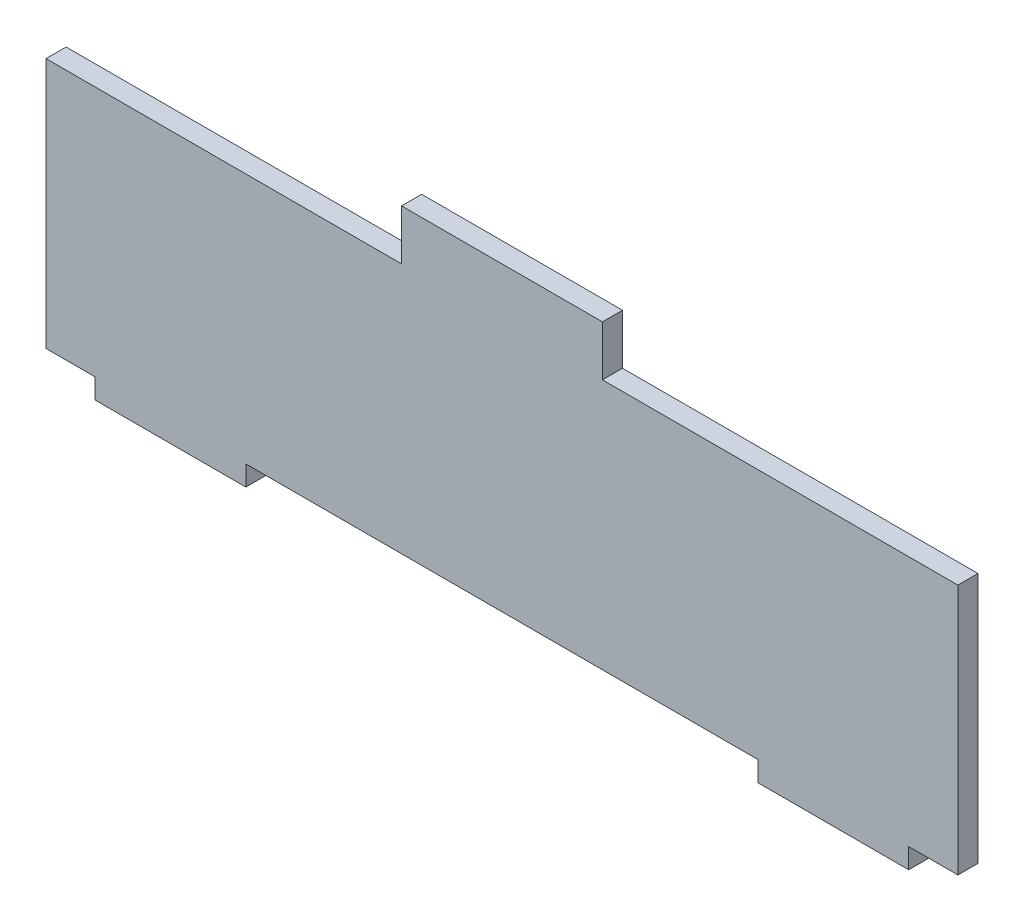
ISO-10303-21;
HEADER;
FILE_DESCRIPTION(('STEP AP214'),'2;1');
FILE_NAME('part.step','',(''),(''),'','','');
FILE_SCHEMA(('AUTOMOTIVE_DESIGN { 1 0 10303 214 1 1 1 1 }'));
ENDSEC;
DATA;
#1=APPLICATION_CONTEXT('core data for automotive mechanical design processes');
#2=APPLICATION_PROTOCOL_DEFINITION('international standard','automotive_design',2000,#1);
#3=PRODUCT_CONTEXT('',#1,'mechanical');
#4=PRODUCT('Part','Part','',(#3));
#5=PRODUCT_RELATED_PRODUCT_CATEGORY('part','',(#4));
#6=PRODUCT_DEFINITION_FORMATION('','',#4);
#7=PRODUCT_DEFINITION_CONTEXT('part definition',#1,'design');
#8=PRODUCT_DEFINITION('design','',#6,#7);
#9=PRODUCT_DEFINITION_SHAPE('','',#8);
#10=(LENGTH_UNIT() NAMED_UNIT(*) SI_UNIT(.MILLI.,.METRE.));
#11=(NAMED_UNIT(*) PLANE_ANGLE_UNIT() SI_UNIT($,.RADIAN.));
#12=(NAMED_UNIT(*) SI_UNIT($,.STERADIAN.) SOLID_ANGLE_UNIT());
#13=UNCERTAINTY_MEASURE_WITH_UNIT(LENGTH_MEASURE(1.E-05),#10,'distance_accuracy_value','');
#14=(GEOMETRIC_REPRESENTATION_CONTEXT(3) GLOBAL_UNCERTAINTY_ASSIGNED_CONTEXT((#13)) GLOBAL_UNIT_ASSIGNED_CONTEXT((#10,
#11,#12)) REPRESENTATION_CONTEXT('',''));
#15=CARTESIAN_POINT('',(0.,0.,0.));
#16=DIRECTION('',(0.,0.,1.));
#17=DIRECTION('',(1.,0.,0.));
#18=AXIS2_PLACEMENT_3D('',#15,#16,#17);
#19=CARTESIAN_POINT('',(20.,25.,4.));
#20=DIRECTION('',(0.,-1.,0.));
#21=DIRECTION('',(0.,0.,-1.));
#22=AXIS2_PLACEMENT_3D('',#19,#20,#21);
#23=PLANE('',#22);
#24=DIRECTION('',(-1.,0.,0.));
#25=VECTOR('',#24,1.);
#26=CARTESIAN_POINT('',(20.,25.,0.));
#27=LINE('',#26,#25);
#28=CARTESIAN_POINT('',(90.8,25.,0.));
#29=VERTEX_POINT('',#28);
#30=CARTESIAN_POINT('',(20.,25.,0.));
#31=VERTEX_POINT('',#30);
#32=EDGE_CURVE('E181',#29,#31,#27,.T.);
#33=ORIENTED_EDGE('',*,*,#32,.T.);
#34=DIRECTION('',(0.,0.,-1.));
#35=VECTOR('',#34,1.);
#36=CARTESIAN_POINT('',(20.,25.,4.));
#37=LINE('',#36,#35);
#38=CARTESIAN_POINT('',(20.,25.,4.));
#39=VERTEX_POINT('',#38);
#40=EDGE_CURVE('E11',#39,#31,#37,.T.);
#41=ORIENTED_EDGE('',*,*,#40,.F.);
#42=DIRECTION('',(-1.,0.,0.));
#43=VECTOR('',#42,1.);
#44=CARTESIAN_POINT('',(20.,25.,4.));
#45=LINE('',#44,#43);
#46=CARTESIAN_POINT('',(90.8,25.,4.));
#47=VERTEX_POINT('',#46);
#48=EDGE_CURVE('E213',#47,#39,#45,.T.);
#49=ORIENTED_EDGE('',*,*,#48,.F.);
#50=DIRECTION('',(0.,0.,-1.));
#51=VECTOR('',#50,1.);
#52=CARTESIAN_POINT('',(90.8,25.,4.));
#53=LINE('',#52,#51);
#54=EDGE_CURVE('E177',#47,#29,#53,.T.);
#55=ORIENTED_EDGE('',*,*,#54,.T.);
#56=EDGE_LOOP('',(#33,#41,#49,#55));
#57=FACE_BOUND('',#56,.T.);
#58=ADVANCED_FACE('F39',(#57),#23,.F.);
#59=CARTESIAN_POINT('',(20.,35.,4.));
#60=DIRECTION('',(-1.,0.,0.));
#61=DIRECTION('',(0.,0.,1.));
#62=AXIS2_PLACEMENT_3D('',#59,#60,#61);
#63=PLANE('',#62);
#64=DIRECTION('',(0.,1.,0.));
#65=VECTOR('',#64,1.);
#66=CARTESIAN_POINT('',(20.,35.,0.));
#67=LINE('',#66,#65);
#68=CARTESIAN_POINT('',(20.,35.,0.));
#69=VERTEX_POINT('',#68);
#70=EDGE_CURVE('E189',#31,#69,#67,.T.);
#71=ORIENTED_EDGE('',*,*,#70,.T.);
#72=DIRECTION('',(0.,0.,-1.));
#73=VECTOR('',#72,1.);
#74=CARTESIAN_POINT('',(20.,35.,4.));
#75=LINE('',#74,#73);
#76=CARTESIAN_POINT('',(20.,35.,4.));
#77=VERTEX_POINT('',#76);
#78=EDGE_CURVE('E50',#77,#69,#75,.T.);
#79=ORIENTED_EDGE('',*,*,#78,.F.);
#80=DIRECTION('',(0.,1.,0.));
#81=VECTOR('',#80,1.);
#82=CARTESIAN_POINT('',(20.,35.,4.));
#83=LINE('',#82,#81);
#84=EDGE_CURVE('E125',#39,#77,#83,.T.);
#85=ORIENTED_EDGE('',*,*,#84,.F.);
#86=ORIENTED_EDGE('',*,*,#40,.T.);
#87=EDGE_LOOP('',(#71,#79,#85,#86));
#88=FACE_BOUND('',#87,.T.);
#89=ADVANCED_FACE('F313',(#88),#63,.F.);
#90=CARTESIAN_POINT('',(-20.,35.,4.));
#91=DIRECTION('',(0.,-1.,0.));
#92=DIRECTION('',(0.,0.,-1.));
#93=AXIS2_PLACEMENT_3D('',#90,#91,#92);
#94=PLANE('',#93);
#95=DIRECTION('',(-1.,0.,0.));
#96=VECTOR('',#95,1.);
#97=CARTESIAN_POINT('',(-20.,35.,0.));
#98=LINE('',#97,#96);
#99=CARTESIAN_POINT('',(-20.,35.,0.));
#100=VERTEX_POINT('',#99);
#101=EDGE_CURVE('E190',#69,#100,#98,.T.);
#102=ORIENTED_EDGE('',*,*,#101,.T.);
#103=DIRECTION('',(0.,0.,-1.));
#104=VECTOR('',#103,1.);
#105=CARTESIAN_POINT('',(-20.,35.,4.));
#106=LINE('',#105,#104);
#107=CARTESIAN_POINT('',(-20.,35.,4.));
#108=VERTEX_POINT('',#107);
#109=EDGE_CURVE('E243',#108,#100,#106,.T.);
#110=ORIENTED_EDGE('',*,*,#109,.F.);
#111=DIRECTION('',(-1.,0.,0.));
#112=VECTOR('',#111,1.);
#113=CARTESIAN_POINT('',(-20.,35.,4.));
#114=LINE('',#113,#112);
#115=EDGE_CURVE('E252',#77,#108,#114,.T.);
#116=ORIENTED_EDGE('',*,*,#115,.F.);
#117=ORIENTED_EDGE('',*,*,#78,.T.);
#118=EDGE_LOOP('',(#102,#110,#116,#117));
#119=FACE_BOUND('',#118,.T.);
#120=ADVANCED_FACE('F249',(#119),#94,.F.);
#121=CARTESIAN_POINT('',(-20.,25.,4.));
#122=DIRECTION('',(1.,0.,0.));
#123=DIRECTION('',(0.,0.,-1.));
#124=AXIS2_PLACEMENT_3D('',#121,#122,#123);
#125=PLANE('',#124);
#126=DIRECTION('',(0.,-1.,0.));
#127=VECTOR('',#126,1.);
#128=CARTESIAN_POINT('',(-20.,25.,0.));
#129=LINE('',#128,#127);
#130=CARTESIAN_POINT('',(-20.,25.,0.));
#131=VERTEX_POINT('',#130);
#132=EDGE_CURVE('E187',#100,#131,#129,.T.);
#133=ORIENTED_EDGE('',*,*,#132,.T.);
#134=DIRECTION('',(0.,0.,-1.));
#135=VECTOR('',#134,1.);
#136=CARTESIAN_POINT('',(-20.,25.,4.));
#137=LINE('',#136,#135);
#138=CARTESIAN_POINT('',(-20.,25.,4.));
#139=VERTEX_POINT('',#138);
#140=EDGE_CURVE('E244',#139,#131,#137,.T.);
#141=ORIENTED_EDGE('',*,*,#140,.F.);
#142=DIRECTION('',(0.,-1.,0.));
#143=VECTOR('',#142,1.);
#144=CARTESIAN_POINT('',(-20.,25.,4.));
#145=LINE('',#144,#143);
#146=EDGE_CURVE('E269',#108,#139,#145,.T.);
#147=ORIENTED_EDGE('',*,*,#146,.F.);
#148=ORIENTED_EDGE('',*,*,#109,.T.);
#149=EDGE_LOOP('',(#133,#141,#147,#148));
#150=FACE_BOUND('',#149,.T.);
#151=ADVANCED_FACE('F261',(#150),#125,.F.);
#152=CARTESIAN_POINT('',(-90.8,25.,4.));
#153=DIRECTION('',(0.,-1.,0.));
#154=DIRECTION('',(0.,0.,-1.));
#155=AXIS2_PLACEMENT_3D('',#152,#153,#154);
#156=PLANE('',#155);
#157=DIRECTION('',(-1.,0.,0.));
#158=VECTOR('',#157,1.);
#159=CARTESIAN_POINT('',(-90.8,25.,0.));
#160=LINE('',#159,#158);
#161=CARTESIAN_POINT('',(-90.8,25.,0.));
#162=VERTEX_POINT('',#161);
#163=EDGE_CURVE('E195',#131,#162,#160,.T.);
#164=ORIENTED_EDGE('',*,*,#163,.T.);
#165=DIRECTION('',(0.,0.,-1.));
#166=VECTOR('',#165,1.);
#167=CARTESIAN_POINT('',(-90.8,25.,4.));
#168=LINE('',#167,#166);
#169=CARTESIAN_POINT('',(-90.8,25.,4.));
#170=VERTEX_POINT('',#169);
#171=EDGE_CURVE('E236',#170,#162,#168,.T.);
#172=ORIENTED_EDGE('',*,*,#171,.F.);
#173=DIRECTION('',(-1.,0.,0.));
#174=VECTOR('',#173,1.);
#175=CARTESIAN_POINT('',(-90.8,25.,4.));
#176=LINE('',#175,#174);
#177=EDGE_CURVE('E270',#139,#170,#176,.T.);
#178=ORIENTED_EDGE('',*,*,#177,.F.);
#179=ORIENTED_EDGE('',*,*,#140,.T.);
#180=EDGE_LOOP('',(#164,#172,#178,#179));
#181=FACE_BOUND('',#180,.T.);
#182=ADVANCED_FACE('F264',(#181),#156,.F.);
#183=CARTESIAN_POINT('',(-90.8,-25.,4.));
#184=DIRECTION('',(1.,0.,0.));
#185=DIRECTION('',(0.,0.,-1.));
#186=AXIS2_PLACEMENT_3D('',#183,#184,#185);
#187=PLANE('',#186);
#188=DIRECTION('',(0.,-1.,0.));
#189=VECTOR('',#188,1.);
#190=CARTESIAN_POINT('',(-90.8,-25.,0.));
#191=LINE('',#190,#189);
#192=CARTESIAN_POINT('',(-90.8,-25.,0.));
#193=VERTEX_POINT('',#192);
#194=EDGE_CURVE('E192',#162,#193,#191,.T.);
#195=ORIENTED_EDGE('',*,*,#194,.T.);
#196=DIRECTION('',(0.,0.,-1.));
#197=VECTOR('',#196,1.);
#198=CARTESIAN_POINT('',(-90.8,-25.,4.));
#199=LINE('',#198,#197);
#200=CARTESIAN_POINT('',(-90.8,-25.,4.));
#201=VERTEX_POINT('',#200);
#202=EDGE_CURVE('E234',#201,#193,#199,.T.);
#203=ORIENTED_EDGE('',*,*,#202,.F.);
#204=DIRECTION('',(0.,-1.,0.));
#205=VECTOR('',#204,1.);
#206=CARTESIAN_POINT('',(-90.8,-25.,4.));
#207=LINE('',#206,#205);
#208=EDGE_CURVE('E267',#170,#201,#207,.T.);
#209=ORIENTED_EDGE('',*,*,#208,.F.);
#210=ORIENTED_EDGE('',*,*,#171,.T.);
#211=EDGE_LOOP('',(#195,#203,#209,#210));
#212=FACE_BOUND('',#211,.T.);
#213=ADVANCED_FACE('F322',(#212),#187,.F.);
#214=CARTESIAN_POINT('',(-90.8,-25.,4.));
#215=DIRECTION('',(0.,1.,0.));
#216=DIRECTION('',(0.,0.,1.));
#217=AXIS2_PLACEMENT_3D('',#214,#215,#216);
#218=PLANE('',#217);
#219=DIRECTION('',(1.,0.,0.));
#220=VECTOR('',#219,1.);
#221=CARTESIAN_POINT('',(-90.8,-25.,0.));
#222=LINE('',#221,#220);
#223=CARTESIAN_POINT('',(-81.,-25.,0.));
#224=VERTEX_POINT('',#223);
#225=EDGE_CURVE('E198',#193,#224,#222,.T.);
#226=ORIENTED_EDGE('',*,*,#225,.T.);
#227=DIRECTION('',(0.,0.,-1.));
#228=VECTOR('',#227,1.);
#229=CARTESIAN_POINT('',(-81.,-25.,4.));
#230=LINE('',#229,#228);
#231=CARTESIAN_POINT('',(-81.,-25.,4.));
#232=VERTEX_POINT('',#231);
#233=EDGE_CURVE('E235',#232,#224,#230,.T.);
#234=ORIENTED_EDGE('',*,*,#233,.F.);
#235=DIRECTION('',(1.,0.,0.));
#236=VECTOR('',#235,1.);
#237=CARTESIAN_POINT('',(-90.8,-25.,4.));
#238=LINE('',#237,#236);
#239=EDGE_CURVE('E275',#201,#232,#238,.T.);
#240=ORIENTED_EDGE('',*,*,#239,.F.);
#241=ORIENTED_EDGE('',*,*,#202,.T.);
#242=EDGE_LOOP('',(#226,#234,#240,#241));
#243=FACE_BOUND('',#242,.T.);
#244=ADVANCED_FACE('F330',(#243),#218,.F.);
#245=CARTESIAN_POINT('',(-81.,-25.,4.));
#246=DIRECTION('',(1.,0.,0.));
#247=DIRECTION('',(0.,0.,-1.));
#248=AXIS2_PLACEMENT_3D('',#245,#246,#247);
#249=PLANE('',#248);
#250=DIRECTION('',(0.,-1.,0.));
#251=VECTOR('',#250,1.);
#252=CARTESIAN_POINT('',(-81.,-25.,0.));
#253=LINE('',#252,#251);
#254=CARTESIAN_POINT('',(-81.,-29.,0.));
#255=VERTEX_POINT('',#254);
#256=EDGE_CURVE('E196',#224,#255,#253,.T.);
#257=ORIENTED_EDGE('',*,*,#256,.T.);
#258=DIRECTION('',(0.,0.,-1.));
#259=VECTOR('',#258,1.);
#260=CARTESIAN_POINT('',(-81.,-29.,4.));
#261=LINE('',#260,#259);
#262=CARTESIAN_POINT('',(-81.,-29.,4.));
#263=VERTEX_POINT('',#262);
#264=EDGE_CURVE('E228',#263,#255,#261,.T.);
#265=ORIENTED_EDGE('',*,*,#264,.F.);
#266=DIRECTION('',(0.,-1.,0.));
#267=VECTOR('',#266,1.);
#268=CARTESIAN_POINT('',(-81.,-25.,4.));
#269=LINE('',#268,#267);
#270=EDGE_CURVE('E279',#232,#263,#269,.T.);
#271=ORIENTED_EDGE('',*,*,#270,.F.);
#272=ORIENTED_EDGE('',*,*,#233,.T.);
#273=EDGE_LOOP('',(#257,#265,#271,#272));
#274=FACE_BOUND('',#273,.T.);
#275=ADVANCED_FACE('F332',(#274),#249,.F.);
#276=CARTESIAN_POINT('',(-81.,-29.,4.));
#277=DIRECTION('',(0.,1.,0.));
#278=DIRECTION('',(-1.,0.,0.));
#279=AXIS2_PLACEMENT_3D('',#276,#277,#278);
#280=PLANE('',#279);
#281=DIRECTION('',(1.,0.,0.));
#282=VECTOR('',#281,1.);
#283=CARTESIAN_POINT('',(-81.,-29.,0.));
#284=LINE('',#283,#282);
#285=CARTESIAN_POINT('',(-51.,-29.,0.));
#286=VERTEX_POINT('',#285);
#287=EDGE_CURVE('E199',#255,#286,#284,.T.);
#288=ORIENTED_EDGE('',*,*,#287,.T.);
#289=DIRECTION('',(0.,0.,-1.));
#290=VECTOR('',#289,1.);
#291=CARTESIAN_POINT('',(-51.,-29.,4.));
#292=LINE('',#291,#290);
#293=CARTESIAN_POINT('',(-51.,-29.,4.));
#294=VERTEX_POINT('',#293);
#295=EDGE_CURVE('E229',#294,#286,#292,.T.);
#296=ORIENTED_EDGE('',*,*,#295,.F.);
#297=DIRECTION('',(1.,0.,0.));
#298=VECTOR('',#297,1.);
#299=CARTESIAN_POINT('',(-81.,-29.,4.));
#300=LINE('',#299,#298);
#301=EDGE_CURVE('E278',#263,#294,#300,.T.);
#302=ORIENTED_EDGE('',*,*,#301,.F.);
#303=ORIENTED_EDGE('',*,*,#264,.T.);
#304=EDGE_LOOP('',(#288,#296,#302,#303));
#305=FACE_BOUND('',#304,.T.);
#306=ADVANCED_FACE('F333',(#305),#280,.F.);
#307=CARTESIAN_POINT('',(-51.,-29.,4.));
#308=DIRECTION('',(-1.,0.,0.));
#309=DIRECTION('',(0.,0.,1.));
#310=AXIS2_PLACEMENT_3D('',#307,#308,#309);
#311=PLANE('',#310);
#312=DIRECTION('',(0.,1.,0.));
#313=VECTOR('',#312,1.);
#314=CARTESIAN_POINT('',(-51.,-29.,0.));
#315=LINE('',#314,#313);
#316=CARTESIAN_POINT('',(-51.,-25.,0.));
#317=VERTEX_POINT('',#316);
#318=EDGE_CURVE('E205',#286,#317,#315,.T.);
#319=ORIENTED_EDGE('',*,*,#318,.T.);
#320=DIRECTION('',(0.,0.,-1.));
#321=VECTOR('',#320,1.);
#322=CARTESIAN_POINT('',(-51.,-25.,4.));
#323=LINE('',#322,#321);
#324=CARTESIAN_POINT('',(-51.,-25.,4.));
#325=VERTEX_POINT('',#324);
#326=EDGE_CURVE('E224',#325,#317,#323,.T.);
#327=ORIENTED_EDGE('',*,*,#326,.F.);
#328=DIRECTION('',(0.,1.,0.));
#329=VECTOR('',#328,1.);
#330=CARTESIAN_POINT('',(-51.,-29.,4.));
#331=LINE('',#330,#329);
#332=EDGE_CURVE('E281',#294,#325,#331,.T.);
#333=ORIENTED_EDGE('',*,*,#332,.F.);
#334=ORIENTED_EDGE('',*,*,#295,.T.);
#335=EDGE_LOOP('',(#319,#327,#333,#334));
#336=FACE_BOUND('',#335,.T.);
#337=ADVANCED_FACE('F338',(#336),#311,.F.);
#338=CARTESIAN_POINT('',(-51.,-25.,4.));
#339=DIRECTION('',(0.,1.,0.));
#340=DIRECTION('',(0.,0.,1.));
#341=AXIS2_PLACEMENT_3D('',#338,#339,#340);
#342=PLANE('',#341);
#343=DIRECTION('',(1.,0.,0.));
#344=VECTOR('',#343,1.);
#345=CARTESIAN_POINT('',(-51.,-25.,0.));
#346=LINE('',#345,#344);
#347=CARTESIAN_POINT('',(51.,-25.,0.));
#348=VERTEX_POINT('',#347);
#349=EDGE_CURVE('E204',#317,#348,#346,.T.);
#350=ORIENTED_EDGE('',*,*,#349,.T.);
#351=DIRECTION('',(0.,0.,-1.));
#352=VECTOR('',#351,1.);
#353=CARTESIAN_POINT('',(51.,-25.,4.));
#354=LINE('',#353,#352);
#355=CARTESIAN_POINT('',(51.,-25.,4.));
#356=VERTEX_POINT('',#355);
#357=EDGE_CURVE('E219',#356,#348,#354,.T.);
#358=ORIENTED_EDGE('',*,*,#357,.F.);
#359=DIRECTION('',(1.,0.,0.));
#360=VECTOR('',#359,1.);
#361=CARTESIAN_POINT('',(-51.,-25.,4.));
#362=LINE('',#361,#360);
#363=EDGE_CURVE('E283',#325,#356,#362,.T.);
#364=ORIENTED_EDGE('',*,*,#363,.F.);
#365=ORIENTED_EDGE('',*,*,#326,.T.);
#366=EDGE_LOOP('',(#350,#358,#364,#365));
#367=FACE_BOUND('',#366,.T.);
#368=ADVANCED_FACE('F341',(#367),#342,.F.);
#369=CARTESIAN_POINT('',(51.,-25.,4.));
#370=DIRECTION('',(1.,0.,0.));
#371=DIRECTION('',(0.,0.,-1.));
#372=AXIS2_PLACEMENT_3D('',#369,#370,#371);
#373=PLANE('',#372);
#374=DIRECTION('',(0.,-1.,0.));
#375=VECTOR('',#374,1.);
#376=CARTESIAN_POINT('',(51.,-25.,0.));
#377=LINE('',#376,#375);
#378=CARTESIAN_POINT('',(51.,-29.,0.));
#379=VERTEX_POINT('',#378);
#380=EDGE_CURVE('E206',#348,#379,#377,.T.);
#381=ORIENTED_EDGE('',*,*,#380,.T.);
#382=DIRECTION('',(0.,0.,-1.));
#383=VECTOR('',#382,1.);
#384=CARTESIAN_POINT('',(51.,-29.,4.));
#385=LINE('',#384,#383);
#386=CARTESIAN_POINT('',(51.,-29.,4.));
#387=VERTEX_POINT('',#386);
#388=EDGE_CURVE('E220',#387,#379,#385,.T.);
#389=ORIENTED_EDGE('',*,*,#388,.F.);
#390=DIRECTION('',(0.,-1.,0.));
#391=VECTOR('',#390,1.);
#392=CARTESIAN_POINT('',(51.,-25.,4.));
#393=LINE('',#392,#391);
#394=EDGE_CURVE('E288',#356,#387,#393,.T.);
#395=ORIENTED_EDGE('',*,*,#394,.F.);
#396=ORIENTED_EDGE('',*,*,#357,.T.);
#397=EDGE_LOOP('',(#381,#389,#395,#396));
#398=FACE_BOUND('',#397,.T.);
#399=ADVANCED_FACE('F295',(#398),#373,.F.);
#400=CARTESIAN_POINT('',(51.,-29.,4.));
#401=DIRECTION('',(0.,1.,0.));
#402=DIRECTION('',(0.,0.,1.));
#403=AXIS2_PLACEMENT_3D('',#400,#401,#402);
#404=PLANE('',#403);
#405=DIRECTION('',(1.,0.,0.));
#406=VECTOR('',#405,1.);
#407=CARTESIAN_POINT('',(51.,-29.,0.));
#408=LINE('',#407,#406);
#409=CARTESIAN_POINT('',(81.,-29.,0.));
#410=VERTEX_POINT('',#409);
#411=EDGE_CURVE('E208',#379,#410,#408,.T.);
#412=ORIENTED_EDGE('',*,*,#411,.T.);
#413=DIRECTION('',(0.,0.,-1.));
#414=VECTOR('',#413,1.);
#415=CARTESIAN_POINT('',(81.,-29.,4.));
#416=LINE('',#415,#414);
#417=CARTESIAN_POINT('',(81.,-29.,4.));
#418=VERTEX_POINT('',#417);
#419=EDGE_CURVE('E173',#418,#410,#416,.T.);
#420=ORIENTED_EDGE('',*,*,#419,.F.);
#421=DIRECTION('',(1.,0.,0.));
#422=VECTOR('',#421,1.);
#423=CARTESIAN_POINT('',(51.,-29.,4.));
#424=LINE('',#423,#422);
#425=EDGE_CURVE('E164',#387,#418,#424,.T.);
#426=ORIENTED_EDGE('',*,*,#425,.F.);
#427=ORIENTED_EDGE('',*,*,#388,.T.);
#428=EDGE_LOOP('',(#412,#420,#426,#427));
#429=FACE_BOUND('',#428,.T.);
#430=ADVANCED_FACE('F299',(#429),#404,.F.);
#431=CARTESIAN_POINT('',(81.,-29.,4.));
#432=DIRECTION('',(-1.,0.,0.));
#433=DIRECTION('',(0.,0.,1.));
#434=AXIS2_PLACEMENT_3D('',#431,#432,#433);
#435=PLANE('',#434);
#436=DIRECTION('',(0.,1.,0.));
#437=VECTOR('',#436,1.);
#438=CARTESIAN_POINT('',(81.,-29.,0.));
#439=LINE('',#438,#437);
#440=CARTESIAN_POINT('',(81.,-25.,0.));
#441=VERTEX_POINT('',#440);
#442=EDGE_CURVE('E175',#410,#441,#439,.T.);
#443=ORIENTED_EDGE('',*,*,#442,.T.);
#444=DIRECTION('',(0.,0.,-1.));
#445=VECTOR('',#444,1.);
#446=CARTESIAN_POINT('',(81.,-25.,4.));
#447=LINE('',#446,#445);
#448=CARTESIAN_POINT('',(81.,-25.,4.));
#449=VERTEX_POINT('',#448);
#450=EDGE_CURVE('E168',#449,#441,#447,.T.);
#451=ORIENTED_EDGE('',*,*,#450,.F.);
#452=DIRECTION('',(0.,1.,0.));
#453=VECTOR('',#452,1.);
#454=CARTESIAN_POINT('',(81.,-29.,4.));
#455=LINE('',#454,#453);
#456=EDGE_CURVE('E157',#418,#449,#455,.T.);
#457=ORIENTED_EDGE('',*,*,#456,.F.);
#458=ORIENTED_EDGE('',*,*,#419,.T.);
#459=EDGE_LOOP('',(#443,#451,#457,#458));
#460=FACE_BOUND('',#459,.T.);
#461=ADVANCED_FACE('F174',(#460),#435,.F.);
#462=CARTESIAN_POINT('',(81.,-25.,4.));
#463=DIRECTION('',(0.,1.,0.));
#464=DIRECTION('',(0.,0.,1.));
#465=AXIS2_PLACEMENT_3D('',#462,#463,#464);
#466=PLANE('',#465);
#467=DIRECTION('',(1.,0.,0.));
#468=VECTOR('',#467,1.);
#469=CARTESIAN_POINT('',(81.,-25.,0.));
#470=LINE('',#469,#468);
#471=CARTESIAN_POINT('',(90.8,-25.,0.));
#472=VERTEX_POINT('',#471);
#473=EDGE_CURVE('E107',#441,#472,#470,.T.);
#474=ORIENTED_EDGE('',*,*,#473,.T.);
#475=DIRECTION('',(0.,0.,-1.));
#476=VECTOR('',#475,1.);
#477=CARTESIAN_POINT('',(90.8,-25.,4.));
#478=LINE('',#477,#476);
#479=CARTESIAN_POINT('',(90.8,-25.,4.));
#480=VERTEX_POINT('',#479);
#481=EDGE_CURVE('E172',#480,#472,#478,.T.);
#482=ORIENTED_EDGE('',*,*,#481,.F.);
#483=DIRECTION('',(1.,0.,0.));
#484=VECTOR('',#483,1.);
#485=CARTESIAN_POINT('',(81.,-25.,4.));
#486=LINE('',#485,#484);
#487=EDGE_CURVE('E162',#449,#480,#486,.T.);
#488=ORIENTED_EDGE('',*,*,#487,.F.);
#489=ORIENTED_EDGE('',*,*,#450,.T.);
#490=EDGE_LOOP('',(#474,#482,#488,#489));
#491=FACE_BOUND('',#490,.T.);
#492=ADVANCED_FACE('F180',(#491),#466,.F.);
#493=CARTESIAN_POINT('',(90.8,-25.,4.));
#494=DIRECTION('',(-1.,0.,0.));
#495=DIRECTION('',(0.,0.,1.));
#496=AXIS2_PLACEMENT_3D('',#493,#494,#495);
#497=PLANE('',#496);
#498=DIRECTION('',(0.,1.,0.));
#499=VECTOR('',#498,1.);
#500=CARTESIAN_POINT('',(90.8,-25.,0.));
#501=LINE('',#500,#499);
#502=EDGE_CURVE('E111',#472,#29,#501,.T.);
#503=ORIENTED_EDGE('',*,*,#502,.T.);
#504=ORIENTED_EDGE('',*,*,#54,.F.);
#505=DIRECTION('',(0.,1.,0.));
#506=VECTOR('',#505,1.);
#507=CARTESIAN_POINT('',(90.8,-25.,4.));
#508=LINE('',#507,#506);
#509=EDGE_CURVE('E54',#480,#47,#508,.T.);
#510=ORIENTED_EDGE('',*,*,#509,.F.);
#511=ORIENTED_EDGE('',*,*,#481,.T.);
#512=EDGE_LOOP('',(#503,#504,#510,#511));
#513=FACE_BOUND('',#512,.T.);
#514=ADVANCED_FACE('F297',(#513),#497,.F.);
#515=CARTESIAN_POINT('',(0.,0.,4.));
#516=DIRECTION('',(0.,0.,1.));
#517=DIRECTION('',(1.,0.,0.));
#518=AXIS2_PLACEMENT_3D('',#515,#516,#517);
#519=PLANE('',#518);
#520=ORIENTED_EDGE('',*,*,#48,.T.);
#521=ORIENTED_EDGE('',*,*,#84,.T.);
#522=ORIENTED_EDGE('',*,*,#115,.T.);
#523=ORIENTED_EDGE('',*,*,#146,.T.);
#524=ORIENTED_EDGE('',*,*,#177,.T.);
#525=ORIENTED_EDGE('',*,*,#208,.T.);
#526=ORIENTED_EDGE('',*,*,#239,.T.);
#527=ORIENTED_EDGE('',*,*,#270,.T.);
#528=ORIENTED_EDGE('',*,*,#301,.T.);
#529=ORIENTED_EDGE('',*,*,#332,.T.);
#530=ORIENTED_EDGE('',*,*,#363,.T.);
#531=ORIENTED_EDGE('',*,*,#394,.T.);
#532=ORIENTED_EDGE('',*,*,#425,.T.);
#533=ORIENTED_EDGE('',*,*,#456,.T.);
#534=ORIENTED_EDGE('',*,*,#487,.T.);
#535=ORIENTED_EDGE('',*,*,#509,.T.);
#536=EDGE_LOOP('',(#520,#521,#522,#523,#524,#525,#526,#527,#528,#529,#530,#531,#532,#533,#534,#535));
#537=FACE_BOUND('',#536,.T.);
#538=ADVANCED_FACE('F161',(#537),#519,.T.);
#539=CARTESIAN_POINT('',(0.,0.,0.));
#540=DIRECTION('',(0.,0.,1.));
#541=DIRECTION('',(1.,0.,0.));
#542=AXIS2_PLACEMENT_3D('',#539,#540,#541);
#543=PLANE('',#542);
#544=ORIENTED_EDGE('',*,*,#32,.F.);
#545=ORIENTED_EDGE('',*,*,#502,.F.);
#546=ORIENTED_EDGE('',*,*,#473,.F.);
#547=ORIENTED_EDGE('',*,*,#442,.F.);
#548=ORIENTED_EDGE('',*,*,#411,.F.);
#549=ORIENTED_EDGE('',*,*,#380,.F.);
#550=ORIENTED_EDGE('',*,*,#349,.F.);
#551=ORIENTED_EDGE('',*,*,#318,.F.);
#552=ORIENTED_EDGE('',*,*,#287,.F.);
#553=ORIENTED_EDGE('',*,*,#256,.F.);
#554=ORIENTED_EDGE('',*,*,#225,.F.);
#555=ORIENTED_EDGE('',*,*,#194,.F.);
#556=ORIENTED_EDGE('',*,*,#163,.F.);
#557=ORIENTED_EDGE('',*,*,#132,.F.);
#558=ORIENTED_EDGE('',*,*,#101,.F.);
#559=ORIENTED_EDGE('',*,*,#70,.F.);
#560=EDGE_LOOP('',(#544,#545,#546,#547,#548,#549,#550,#551,#552,#553,#554,#555,#556,#557,#558,#559));
#561=FACE_BOUND('',#560,.T.);
#562=ADVANCED_FACE('F258',(#561),#543,.F.);
#563=CLOSED_SHELL('',(#58,#89,#120,#151,#182,#213,#244,#275,#306,#337,#368,#399,#430,#461,#492,
#514,#538,#562));
#564=MANIFOLD_SOLID_BREP('B2',#563);
#565=ADVANCED_BREP_SHAPE_REPRESENTATION('',(#18,#564),#14);
#566=SHAPE_DEFINITION_REPRESENTATION(#9,#565);
ENDSEC;
END-ISO-10303-21;
